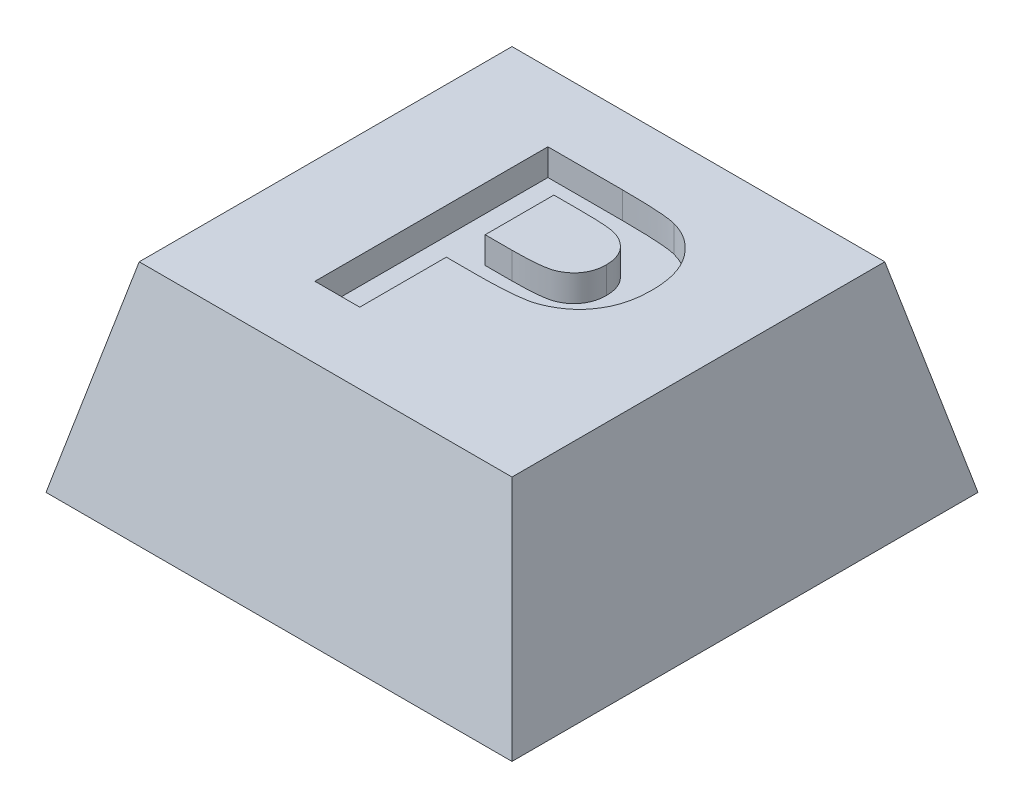
ISO-10303-21;
HEADER;
FILE_DESCRIPTION(('STEP AP214'),'2;1');
FILE_NAME('part.step','',(''),(''),'','','');
FILE_SCHEMA(('AUTOMOTIVE_DESIGN { 1 0 10303 214 1 1 1 1 }'));
ENDSEC;
DATA;
#1=APPLICATION_CONTEXT('core data for automotive mechanical design processes');
#2=APPLICATION_PROTOCOL_DEFINITION('international standard','automotive_design',2000,#1);
#3=PRODUCT_CONTEXT('',#1,'mechanical');
#4=PRODUCT('Part','Part','',(#3));
#5=PRODUCT_RELATED_PRODUCT_CATEGORY('part','',(#4));
#6=PRODUCT_DEFINITION_FORMATION('','',#4);
#7=PRODUCT_DEFINITION_CONTEXT('part definition',#1,'design');
#8=PRODUCT_DEFINITION('design','',#6,#7);
#9=PRODUCT_DEFINITION_SHAPE('','',#8);
#10=(LENGTH_UNIT() NAMED_UNIT(*) SI_UNIT(.MILLI.,.METRE.));
#11=(NAMED_UNIT(*) PLANE_ANGLE_UNIT() SI_UNIT($,.RADIAN.));
#12=(NAMED_UNIT(*) SI_UNIT($,.STERADIAN.) SOLID_ANGLE_UNIT());
#13=UNCERTAINTY_MEASURE_WITH_UNIT(LENGTH_MEASURE(1.E-05),#10,'distance_accuracy_value','');
#14=(GEOMETRIC_REPRESENTATION_CONTEXT(3) GLOBAL_UNCERTAINTY_ASSIGNED_CONTEXT((#13)) GLOBAL_UNIT_ASSIGNED_CONTEXT((#10,
#11,#12)) REPRESENTATION_CONTEXT('',''));
#15=CARTESIAN_POINT('',(0.,0.,0.));
#16=DIRECTION('',(0.,0.,1.));
#17=DIRECTION('',(1.,0.,0.));
#18=AXIS2_PLACEMENT_3D('',#15,#16,#17);
#19=CARTESIAN_POINT('',(0.,3.,0.));
#20=DIRECTION('',(0.,-1.,0.));
#21=DIRECTION('',(0.,0.,-1.));
#22=AXIS2_PLACEMENT_3D('',#19,#20,#21);
#23=PLANE('',#22);
#24=DIRECTION('',(-1.,0.,0.));
#25=VECTOR('',#24,1.);
#26=CARTESIAN_POINT('',(11.,3.,-0.7));
#27=LINE('',#26,#25);
#28=CARTESIAN_POINT('',(6.3,3.,-0.7));
#29=VERTEX_POINT('',#28);
#30=CARTESIAN_POINT('',(0.7,3.,-0.7));
#31=VERTEX_POINT('',#30);
#32=EDGE_CURVE('E375',#29,#31,#27,.T.);
#33=ORIENTED_EDGE('',*,*,#32,.F.);
#34=DIRECTION('',(0.,0.,1.));
#35=VECTOR('',#34,1.);
#36=CARTESIAN_POINT('',(6.3,3.,-7.));
#37=LINE('',#36,#35);
#38=CARTESIAN_POINT('',(6.3,3.,-6.3));
#39=VERTEX_POINT('',#38);
#40=EDGE_CURVE('E387',#39,#29,#37,.T.);
#41=ORIENTED_EDGE('',*,*,#40,.F.);
#42=DIRECTION('',(-1.,0.,0.));
#43=VECTOR('',#42,1.);
#44=CARTESIAN_POINT('',(11.,3.,-6.3));
#45=LINE('',#44,#43);
#46=CARTESIAN_POINT('',(0.699999999999998,3.,-6.3));
#47=VERTEX_POINT('',#46);
#48=EDGE_CURVE('E371',#39,#47,#45,.T.);
#49=ORIENTED_EDGE('',*,*,#48,.T.);
#50=DIRECTION('',(0.,0.,1.));
#51=VECTOR('',#50,1.);
#52=CARTESIAN_POINT('',(0.7,3.,-7.));
#53=LINE('',#52,#51);
#54=EDGE_CURVE('E388',#47,#31,#53,.T.);
#55=ORIENTED_EDGE('',*,*,#54,.T.);
#56=EDGE_LOOP('',(#33,#41,#49,#55));
#57=FACE_BOUND('',#56,.T.);
#58=DIRECTION('',(-1.,0.,0.));
#59=VECTOR('',#58,1.);
#60=CARTESIAN_POINT('',(2.94651388909162,3.,-1.76602931918881));
#61=LINE('',#60,#59);
#62=CARTESIAN_POINT('',(2.94651388909162,3.,-1.76602931918881));
#63=VERTEX_POINT('',#62);
#64=CARTESIAN_POINT('',(2.2734369660147,3.,-1.76602931918881));
#65=VERTEX_POINT('',#64);
#66=EDGE_CURVE('E58',#63,#65,#61,.T.);
#67=ORIENTED_EDGE('',*,*,#66,.T.);
#68=DIRECTION('',(0.,0.,-1.));
#69=VECTOR('',#68,1.);
#70=CARTESIAN_POINT('',(2.2734369660147,3.,-1.76602931918881));
#71=LINE('',#70,#69);
#72=CARTESIAN_POINT('',(2.2734369660147,3.,-5.26602931918881));
#73=VERTEX_POINT('',#72);
#74=EDGE_CURVE('E287',#65,#73,#71,.T.);
#75=ORIENTED_EDGE('',*,*,#74,.T.);
#76=DIRECTION('',(1.,0.,0.));
#77=VECTOR('',#76,1.);
#78=CARTESIAN_POINT('',(2.2734369660147,3.,-5.26602931918881));
#79=LINE('',#78,#77);
#80=CARTESIAN_POINT('',(3.39312847242496,3.,-5.26602931918881));
#81=VERTEX_POINT('',#80);
#82=EDGE_CURVE('E291',#73,#81,#79,.T.);
#83=ORIENTED_EDGE('',*,*,#82,.T.);
#84=CARTESIAN_POINT('',(3.39312847242496,3.,-5.26602931918881));
#85=CARTESIAN_POINT('',(3.44384460666334,3.,-5.26597393477193));
#86=CARTESIAN_POINT('',(3.54084524256604,3.,-5.2658680054905));
#87=CARTESIAN_POINT('',(3.67921078229405,3.,-5.26292484630846));
#88=CARTESIAN_POINT('',(3.80378822142235,3.,-5.25875848015571));
#89=CARTESIAN_POINT('',(3.91439266700303,3.,-5.25356944741172));
#90=CARTESIAN_POINT('',(4.01141330703681,3.,-5.245826413962));
#91=CARTESIAN_POINT('',(4.09441491785956,3.,-5.23686009772664));
#92=CARTESIAN_POINT('',(4.16392015518062,3.,-5.2272147208261));
#93=CARTESIAN_POINT('',(4.20484973044381,3.,-5.21723304572984));
#94=CARTESIAN_POINT('',(4.22325667755316,3.,-5.21274406277855));
#95=B_SPLINE_CURVE_WITH_KNOTS('',3,(#84,#85,#86,#87,#88,#89,#90,#91,#92,#93,#94),.UNSPECIFIED.,
.F.,.F.,(4,1,1,1,1,1,1,1,4),(0.,0.182560685864354,0.34916901466577,0.498161909879465,
0.631255146517795,0.747720654497027,0.848429126955914,0.931835182126823,1.),.UNSPECIFIED.);
#96=CARTESIAN_POINT('',(4.22325667755316,3.,-5.21274406277855));
#97=VERTEX_POINT('',#96);
#98=EDGE_CURVE('E295',#81,#97,#95,.T.);
#99=ORIENTED_EDGE('',*,*,#98,.T.);
#100=CARTESIAN_POINT('',(4.22325667755316,3.,-5.21274406277855));
#101=CARTESIAN_POINT('',(4.24773344106299,3.,-5.20576479426287));
#102=CARTESIAN_POINT('',(4.29631408209239,3.,-5.19191258139689));
#103=CARTESIAN_POINT('',(4.36591499143795,3.,-5.16238186394301));
#104=CARTESIAN_POINT('',(4.43299924674262,3.,-5.12815733784217));
#105=CARTESIAN_POINT('',(4.49672400619187,3.,-5.08736788903686));
#106=CARTESIAN_POINT('',(4.55730589023362,3.,-5.0407376742319));
#107=CARTESIAN_POINT('',(4.61492497598965,3.,-4.98864696887681));
#108=CARTESIAN_POINT('',(4.6698885377768,3.,-4.93086062470867));
#109=CARTESIAN_POINT('',(4.72143622536671,3.,-4.86749279516598));
#110=CARTESIAN_POINT('',(4.7686478432573,3.,-4.79886301373164));
#111=CARTESIAN_POINT('',(4.80945054315446,3.,-4.72486981282646));
#112=CARTESIAN_POINT('',(4.84363467430126,3.,-4.64583480487816));
#113=CARTESIAN_POINT('',(4.87275898590933,3.,-4.56235192811533));
#114=CARTESIAN_POINT('',(4.89424704191297,3.,-4.47352611075403));
#115=CARTESIAN_POINT('',(4.90928477448103,3.,-4.37997452469397));
#116=CARTESIAN_POINT('',(4.91975291269072,3.,-4.28165625246629));
#117=CARTESIAN_POINT('',(4.92049408926106,3.,-4.21437524560431));
#118=CARTESIAN_POINT('',(4.9208728634506,3.,-4.1799916589324));
#119=B_SPLINE_CURVE_WITH_KNOTS('',3,(#100,#101,#102,#103,#104,#105,#106,#107,#108,#109,#110,
#111,#112,#113,#114,#115,#116,#117,#118),.UNSPECIFIED.,.F.,.F.,(4,1,1,1,1,1,1,1,1,1,1,1,1,1,1,1,
4),(0.,0.0566966089636374,0.112529485629921,0.168226041849801,0.224453827384143,
0.280939346530923,0.338491443016692,0.397460189057406,0.458574525663164,0.520430686158555,
0.582933063936771,0.646631562091253,0.712213800813204,0.779824213865235,0.850065838275486,
0.923376975387565,1.),.UNSPECIFIED.);
#120=CARTESIAN_POINT('',(4.9208728634506,3.,-4.1799916589324));
#121=VERTEX_POINT('',#120);
#122=EDGE_CURVE('E301',#97,#121,#119,.T.);
#123=ORIENTED_EDGE('',*,*,#122,.T.);
#124=CARTESIAN_POINT('',(4.9208728634506,3.,-4.1799916589324));
#125=CARTESIAN_POINT('',(4.91979260141583,3.,-4.127776273473));
#126=CARTESIAN_POINT('',(4.91771303768266,3.,-4.02725878936185));
#127=CARTESIAN_POINT('',(4.89444640942433,3.,-3.88315479276662));
#128=CARTESIAN_POINT('',(4.85895907765527,3.,-3.75152508158741));
#129=CARTESIAN_POINT('',(4.80709177819764,3.,-3.63363752313297));
#130=CARTESIAN_POINT('',(4.74385476538337,3.,-3.52902950688606));
#131=CARTESIAN_POINT('',(4.67419789382521,3.,-3.43472587428024));
#132=CARTESIAN_POINT('',(4.59465998302824,3.,-3.35356903257407));
#133=CARTESIAN_POINT('',(4.50872628669571,3.,-3.284249258959));
#134=CARTESIAN_POINT('',(4.41791007550825,3.,-3.22752083221151));
#135=CARTESIAN_POINT('',(4.32692946837898,3.,-3.1791606538283));
#136=CARTESIAN_POINT('',(4.23455681507544,3.,-3.1419798034708));
#137=CARTESIAN_POINT('',(4.17157734572903,3.,-3.12577980795889));
#138=CARTESIAN_POINT('',(4.14052430575829,3.,-3.11779213970163));
#139=B_SPLINE_CURVE_WITH_KNOTS('',3,(#124,#125,#126,#127,#128,#129,#130,#131,#132,#133,#134,
#135,#136,#137,#138),.UNSPECIFIED.,.F.,.F.,(4,1,1,1,1,1,1,1,1,1,1,1,4),(0.,0.109365519513397,
0.210534630229698,0.305156984724238,0.394451765400026,0.479483538783234,0.561008944761299,
0.639657023389005,0.717014175655742,0.791903899167708,0.86378270051793,0.932835870333303,1.),.UNSPECIFIED.);
#140=CARTESIAN_POINT('',(4.14052430575829,3.,-3.11779213970163));
#141=VERTEX_POINT('',#140);
#142=EDGE_CURVE('E310',#121,#141,#139,.T.);
#143=ORIENTED_EDGE('',*,*,#142,.T.);
#144=CARTESIAN_POINT('',(4.14052430575829,3.,-3.11779213970163));
#145=CARTESIAN_POINT('',(4.11836016878902,3.,-3.11357599997096));
#146=CARTESIAN_POINT('',(4.0716408125589,3.,-3.10468888046496));
#147=CARTESIAN_POINT('',(3.99754670840814,3.,-3.09583003982429));
#148=CARTESIAN_POINT('',(3.9165578369515,3.,-3.08602426907442));
#149=CARTESIAN_POINT('',(3.82834108549815,3.,-3.0796283944522));
#150=CARTESIAN_POINT('',(3.73300317332558,3.,-3.0736389260249));
#151=CARTESIAN_POINT('',(3.63058112048286,3.,-3.07081110023836));
#152=CARTESIAN_POINT('',(3.52122129904794,3.,-3.06740414440708));
#153=CARTESIAN_POINT('',(3.44594968980433,3.,-3.06734292568563));
#154=CARTESIAN_POINT('',(3.40715090832239,3.,-3.06731137047086));
#155=B_SPLINE_CURVE_WITH_KNOTS('',3,(#144,#145,#146,#147,#148,#149,#150,#151,#152,#153,#154),
.UNSPECIFIED.,.F.,.F.,(4,1,1,1,1,1,1,1,4),(0.,0.0919192432606359,0.193754797502383,
0.303983189193224,0.424368181524799,0.554124139817009,0.693262123791844,0.841891837429479,1.),.UNSPECIFIED.);
#156=CARTESIAN_POINT('',(3.40715090832239,3.,-3.06731137047086));
#157=VERTEX_POINT('',#156);
#158=EDGE_CURVE('E319',#141,#157,#155,.T.);
#159=ORIENTED_EDGE('',*,*,#158,.T.);
#160=DIRECTION('',(-1.,0.,0.));
#161=VECTOR('',#160,1.);
#162=CARTESIAN_POINT('',(3.40715090832239,3.,-3.06731137047086));
#163=LINE('',#162,#161);
#164=CARTESIAN_POINT('',(2.94651388909162,3.,-3.06731137047086));
#165=VERTEX_POINT('',#164);
#166=EDGE_CURVE('E328',#157,#165,#163,.T.);
#167=ORIENTED_EDGE('',*,*,#166,.T.);
#168=DIRECTION('',(0.,0.,1.));
#169=VECTOR('',#168,1.);
#170=CARTESIAN_POINT('',(2.94651388909162,3.,-3.06731137047086));
#171=LINE('',#170,#169);
#172=EDGE_CURVE('E335',#165,#63,#171,.T.);
#173=ORIENTED_EDGE('',*,*,#172,.T.);
#174=EDGE_LOOP('',(#67,#75,#83,#99,#123,#143,#159,#167,#173));
#175=FACE_BOUND('',#174,.T.);
#176=ADVANCED_FACE('F42',(#57,#175),#23,.F.);
#177=CARTESIAN_POINT('',(7.,0.,-7.));
#178=DIRECTION('',(-0.973841209741793,-0.227229615606418,0.));
#179=DIRECTION('',(0.227229615606418,-0.973841209741793,0.));
#180=AXIS2_PLACEMENT_3D('',#177,#178,#179);
#181=PLANE('',#180);
#182=DIRECTION('',(-0.221581128241521,0.949633406749377,-0.221581128241521));
#183=VECTOR('',#182,1.);
#184=CARTESIAN_POINT('',(6.6563126252505,1.47294589178357,-0.343687374749499));
#185=LINE('',#184,#183);
#186=CARTESIAN_POINT('',(7.,0.,0.));
#187=VERTEX_POINT('',#186);
#188=EDGE_CURVE('E384',#187,#29,#185,.T.);
#189=ORIENTED_EDGE('',*,*,#188,.F.);
#190=DIRECTION('',(0.,0.,-1.));
#191=VECTOR('',#190,1.);
#192=CARTESIAN_POINT('',(7.,0.,0.));
#193=LINE('',#192,#191);
#194=CARTESIAN_POINT('',(7.,0.,-7.));
#195=VERTEX_POINT('',#194);
#196=EDGE_CURVE('E402',#187,#195,#193,.T.);
#197=ORIENTED_EDGE('',*,*,#196,.T.);
#198=DIRECTION('',(0.221581128241521,-0.949633406749377,-0.221581128241521));
#199=VECTOR('',#198,1.);
#200=CARTESIAN_POINT('',(7.,0.,-7.));
#201=LINE('',#200,#199);
#202=EDGE_CURVE('E378',#39,#195,#201,.T.);
#203=ORIENTED_EDGE('',*,*,#202,.F.);
#204=ORIENTED_EDGE('',*,*,#40,.T.);
#205=EDGE_LOOP('',(#189,#197,#203,#204));
#206=FACE_BOUND('',#205,.T.);
#207=ADVANCED_FACE('F428',(#206),#181,.F.);
#208=CARTESIAN_POINT('',(0.,0.,-7.));
#209=DIRECTION('',(0.973841209741793,-0.227229615606418,0.));
#210=DIRECTION('',(0.227229615606418,0.973841209741793,0.));
#211=AXIS2_PLACEMENT_3D('',#208,#209,#210);
#212=PLANE('',#211);
#213=DIRECTION('',(-0.221581128241521,-0.949633406749378,0.221581128241521));
#214=VECTOR('',#213,1.);
#215=CARTESIAN_POINT('',(0.343687374749499,1.47294589178357,-0.3436873747495));
#216=LINE('',#215,#214);
#217=CARTESIAN_POINT('',(0.,0.,0.));
#218=VERTEX_POINT('',#217);
#219=EDGE_CURVE('E11',#31,#218,#216,.T.);
#220=ORIENTED_EDGE('',*,*,#219,.F.);
#221=ORIENTED_EDGE('',*,*,#54,.F.);
#222=DIRECTION('',(0.221581128241521,0.949633406749377,0.221581128241521));
#223=VECTOR('',#222,1.);
#224=CARTESIAN_POINT('',(0.,0.,-7.));
#225=LINE('',#224,#223);
#226=CARTESIAN_POINT('',(0.,0.,-7.));
#227=VERTEX_POINT('',#226);
#228=EDGE_CURVE('E51',#227,#47,#225,.T.);
#229=ORIENTED_EDGE('',*,*,#228,.F.);
#230=DIRECTION('',(0.,0.,1.));
#231=VECTOR('',#230,1.);
#232=CARTESIAN_POINT('',(0.,0.,0.));
#233=LINE('',#232,#231);
#234=EDGE_CURVE('E392',#227,#218,#233,.T.);
#235=ORIENTED_EDGE('',*,*,#234,.T.);
#236=EDGE_LOOP('',(#220,#221,#229,#235));
#237=FACE_BOUND('',#236,.T.);
#238=ADVANCED_FACE('F422',(#237),#212,.F.);
#239=CARTESIAN_POINT('',(0.,0.,0.));
#240=DIRECTION('',(0.,-1.,0.));
#241=DIRECTION('',(0.,0.,-1.));
#242=AXIS2_PLACEMENT_3D('',#239,#240,#241);
#243=PLANE('',#242);
#244=CARTESIAN_POINT('',(3.5,0.,-3.5));
#245=DIRECTION('',(0.,-1.,0.));
#246=DIRECTION('',(0.,0.,-1.));
#247=AXIS2_PLACEMENT_3D('',#244,#245,#246);
#248=CIRCLE('',#247,1.8);
#249=CARTESIAN_POINT('',(3.5,0.,-5.3));
#250=VERTEX_POINT('',#249);
#251=EDGE_CURVE('E366',#250,#250,#248,.T.);
#252=ORIENTED_EDGE('',*,*,#251,.F.);
#253=EDGE_LOOP('',(#252));
#254=FACE_BOUND('',#253,.T.);
#255=ORIENTED_EDGE('',*,*,#234,.F.);
#256=DIRECTION('',(-1.,0.,0.));
#257=VECTOR('',#256,1.);
#258=CARTESIAN_POINT('',(0.,0.,-7.));
#259=LINE('',#258,#257);
#260=EDGE_CURVE('E406',#195,#227,#259,.T.);
#261=ORIENTED_EDGE('',*,*,#260,.F.);
#262=ORIENTED_EDGE('',*,*,#196,.F.);
#263=DIRECTION('',(1.,0.,0.));
#264=VECTOR('',#263,1.);
#265=CARTESIAN_POINT('',(0.,0.,0.));
#266=LINE('',#265,#264);
#267=EDGE_CURVE('E399',#218,#187,#266,.T.);
#268=ORIENTED_EDGE('',*,*,#267,.F.);
#269=EDGE_LOOP('',(#255,#261,#262,#268));
#270=FACE_BOUND('',#269,.T.);
#271=ADVANCED_FACE('F44',(#254,#270),#243,.T.);
#272=CARTESIAN_POINT('',(11.,3.,-6.3));
#273=DIRECTION('',(0.,0.227229615606418,-0.973841209741793));
#274=DIRECTION('',(0.,0.973841209741793,0.227229615606418));
#275=AXIS2_PLACEMENT_3D('',#272,#273,#274);
#276=PLANE('',#275);
#277=ORIENTED_EDGE('',*,*,#202,.T.);
#278=ORIENTED_EDGE('',*,*,#260,.T.);
#279=ORIENTED_EDGE('',*,*,#228,.T.);
#280=ORIENTED_EDGE('',*,*,#48,.F.);
#281=EDGE_LOOP('',(#277,#278,#279,#280));
#282=FACE_BOUND('',#281,.T.);
#283=ADVANCED_FACE('F411',(#282),#276,.T.);
#284=CARTESIAN_POINT('',(11.,0.,0.));
#285=DIRECTION('',(0.,0.227229615606418,0.973841209741793));
#286=DIRECTION('',(0.,-0.973841209741793,0.227229615606418));
#287=AXIS2_PLACEMENT_3D('',#284,#285,#286);
#288=PLANE('',#287);
#289=ORIENTED_EDGE('',*,*,#188,.T.);
#290=ORIENTED_EDGE('',*,*,#32,.T.);
#291=ORIENTED_EDGE('',*,*,#219,.T.);
#292=ORIENTED_EDGE('',*,*,#267,.T.);
#293=EDGE_LOOP('',(#289,#290,#291,#292));
#294=FACE_BOUND('',#293,.T.);
#295=ADVANCED_FACE('F425',(#294),#288,.T.);
#296=CARTESIAN_POINT('',(3.5,0.8,-3.5));
#297=DIRECTION('',(0.,-1.,0.));
#298=DIRECTION('',(0.,0.,-1.));
#299=AXIS2_PLACEMENT_3D('',#296,#297,#298);
#300=CYLINDRICAL_SURFACE('',#299,1.8);
#301=CARTESIAN_POINT('',(3.5,0.8,-3.5));
#302=DIRECTION('',(0.,-1.,0.));
#303=DIRECTION('',(0.,0.,-1.));
#304=AXIS2_PLACEMENT_3D('',#301,#302,#303);
#305=CIRCLE('',#304,1.8);
#306=CARTESIAN_POINT('',(3.5,0.8,-5.3));
#307=VERTEX_POINT('',#306);
#308=EDGE_CURVE('E367',#307,#307,#305,.T.);
#309=ORIENTED_EDGE('',*,*,#308,.F.);
#310=EDGE_LOOP('',(#309));
#311=FACE_BOUND('',#310,.T.);
#312=ORIENTED_EDGE('',*,*,#251,.T.);
#313=EDGE_LOOP('',(#312));
#314=FACE_BOUND('',#313,.T.);
#315=ADVANCED_FACE('F540',(#311,#314),#300,.F.);
#316=CARTESIAN_POINT('',(3.5,0.8,-3.5));
#317=DIRECTION('',(0.,-1.,0.));
#318=DIRECTION('',(0.,0.,-1.));
#319=AXIS2_PLACEMENT_3D('',#316,#317,#318);
#320=PLANE('',#319);
#321=ORIENTED_EDGE('',*,*,#308,.T.);
#322=EDGE_LOOP('',(#321));
#323=FACE_BOUND('',#322,.T.);
#324=ADVANCED_FACE('F537',(#323),#320,.T.);
#325=CARTESIAN_POINT('',(2.94651388909162,2.6,-1.76602931918881));
#326=DIRECTION('',(0.,0.,-1.));
#327=DIRECTION('',(-1.,0.,0.));
#328=AXIS2_PLACEMENT_3D('',#325,#326,#327);
#329=PLANE('',#328);
#330=ORIENTED_EDGE('',*,*,#66,.F.);
#331=DIRECTION('',(0.,1.,0.));
#332=VECTOR('',#331,1.);
#333=CARTESIAN_POINT('',(2.94651388909162,2.6,-1.76602931918881));
#334=LINE('',#333,#332);
#335=CARTESIAN_POINT('',(2.94651388909162,2.6,-1.76602931918881));
#336=VERTEX_POINT('',#335);
#337=EDGE_CURVE('E284',#336,#63,#334,.T.);
#338=ORIENTED_EDGE('',*,*,#337,.F.);
#339=DIRECTION('',(-1.,0.,0.));
#340=VECTOR('',#339,1.);
#341=CARTESIAN_POINT('',(2.94651388909162,2.6,-1.76602931918881));
#342=LINE('',#341,#340);
#343=CARTESIAN_POINT('',(2.2734369660147,2.6,-1.76602931918881));
#344=VERTEX_POINT('',#343);
#345=EDGE_CURVE('E339',#336,#344,#342,.T.);
#346=ORIENTED_EDGE('',*,*,#345,.T.);
#347=DIRECTION('',(0.,1.,0.));
#348=VECTOR('',#347,1.);
#349=CARTESIAN_POINT('',(2.2734369660147,2.6,-1.76602931918881));
#350=LINE('',#349,#348);
#351=EDGE_CURVE('E363',#344,#65,#350,.T.);
#352=ORIENTED_EDGE('',*,*,#351,.T.);
#353=EDGE_LOOP('',(#330,#338,#346,#352));
#354=FACE_BOUND('',#353,.T.);
#355=ADVANCED_FACE('F533',(#354),#329,.T.);
#356=CARTESIAN_POINT('',(2.2734369660147,2.6,-1.76602931918881));
#357=DIRECTION('',(1.,0.,0.));
#358=DIRECTION('',(0.,0.,-1.));
#359=AXIS2_PLACEMENT_3D('',#356,#357,#358);
#360=PLANE('',#359);
#361=ORIENTED_EDGE('',*,*,#74,.F.);
#362=ORIENTED_EDGE('',*,*,#351,.F.);
#363=DIRECTION('',(0.,0.,-1.));
#364=VECTOR('',#363,1.);
#365=CARTESIAN_POINT('',(2.2734369660147,2.6,-1.76602931918881));
#366=LINE('',#365,#364);
#367=CARTESIAN_POINT('',(2.2734369660147,2.6,-5.26602931918881));
#368=VERTEX_POINT('',#367);
#369=EDGE_CURVE('E502',#344,#368,#366,.T.);
#370=ORIENTED_EDGE('',*,*,#369,.T.);
#371=DIRECTION('',(0.,1.,0.));
#372=VECTOR('',#371,1.);
#373=CARTESIAN_POINT('',(2.2734369660147,2.6,-5.26602931918881));
#374=LINE('',#373,#372);
#375=EDGE_CURVE('E360',#368,#73,#374,.T.);
#376=ORIENTED_EDGE('',*,*,#375,.T.);
#377=EDGE_LOOP('',(#361,#362,#370,#376));
#378=FACE_BOUND('',#377,.T.);
#379=ADVANCED_FACE('F529',(#378),#360,.T.);
#380=CARTESIAN_POINT('',(2.2734369660147,2.6,-5.26602931918881));
#381=DIRECTION('',(0.,0.,1.));
#382=DIRECTION('',(1.,0.,0.));
#383=AXIS2_PLACEMENT_3D('',#380,#381,#382);
#384=PLANE('',#383);
#385=ORIENTED_EDGE('',*,*,#82,.F.);
#386=ORIENTED_EDGE('',*,*,#375,.F.);
#387=DIRECTION('',(1.,0.,0.));
#388=VECTOR('',#387,1.);
#389=CARTESIAN_POINT('',(2.2734369660147,2.6,-5.26602931918881));
#390=LINE('',#389,#388);
#391=CARTESIAN_POINT('',(3.39312847242496,2.6,-5.26602931918881));
#392=VERTEX_POINT('',#391);
#393=EDGE_CURVE('E505',#368,#392,#390,.T.);
#394=ORIENTED_EDGE('',*,*,#393,.T.);
#395=DIRECTION('',(0.,1.,0.));
#396=VECTOR('',#395,1.);
#397=CARTESIAN_POINT('',(3.39312847242496,2.6,-5.26602931918881));
#398=LINE('',#397,#396);
#399=EDGE_CURVE('E357',#392,#81,#398,.T.);
#400=ORIENTED_EDGE('',*,*,#399,.T.);
#401=EDGE_LOOP('',(#385,#386,#394,#400));
#402=FACE_BOUND('',#401,.T.);
#403=ADVANCED_FACE('F525',(#402),#384,.T.);
#404=CARTESIAN_POINT('',(3.39312847242496,2.6,-5.26602931918881));
#405=CARTESIAN_POINT('',(3.44384460666334,2.6,-5.26597393477193));
#406=CARTESIAN_POINT('',(3.54084524256604,2.6,-5.2658680054905));
#407=CARTESIAN_POINT('',(3.67921078229405,2.6,-5.26292484630846));
#408=CARTESIAN_POINT('',(3.80378822142235,2.6,-5.25875848015571));
#409=CARTESIAN_POINT('',(3.91439266700303,2.6,-5.25356944741172));
#410=CARTESIAN_POINT('',(4.01141330703681,2.6,-5.245826413962));
#411=CARTESIAN_POINT('',(4.09441491785956,2.6,-5.23686009772664));
#412=CARTESIAN_POINT('',(4.16392015518062,2.6,-5.2272147208261));
#413=CARTESIAN_POINT('',(4.20484973044381,2.6,-5.21723304572984));
#414=CARTESIAN_POINT('',(4.22325667755316,2.6,-5.21274406277855));
#415=B_SPLINE_CURVE_WITH_KNOTS('',3,(#404,#405,#406,#407,#408,#409,#410,#411,#412,#413,#414),
.UNSPECIFIED.,.F.,.F.,(4,1,1,1,1,1,1,1,4),(0.,0.182560685864354,0.34916901466577,
0.498161909879465,0.631255146517795,0.747720654497027,0.848429126955914,0.931835182126823,1.),.UNSPECIFIED.);
#416=DIRECTION('',(0.,1.,0.));
#417=VECTOR('',#416,1.);
#418=SURFACE_OF_LINEAR_EXTRUSION('',#415,#417);
#419=ORIENTED_EDGE('',*,*,#98,.F.);
#420=ORIENTED_EDGE('',*,*,#399,.F.);
#421=CARTESIAN_POINT('',(4.22325667755316,2.6,-5.21274406277855));
#422=VERTEX_POINT('',#421);
#423=EDGE_CURVE('E508',#392,#422,#415,.T.);
#424=ORIENTED_EDGE('',*,*,#423,.T.);
#425=DIRECTION('',(0.,1.,0.));
#426=VECTOR('',#425,1.);
#427=CARTESIAN_POINT('',(4.22325667755316,2.6,-5.21274406277855));
#428=LINE('',#427,#426);
#429=EDGE_CURVE('E354',#422,#97,#428,.T.);
#430=ORIENTED_EDGE('',*,*,#429,.T.);
#431=EDGE_LOOP('',(#419,#420,#424,#430));
#432=FACE_BOUND('',#431,.T.);
#433=ADVANCED_FACE('F521',(#432),#418,.T.);
#434=CARTESIAN_POINT('',(4.22325667755316,2.6,-5.21274406277855));
#435=CARTESIAN_POINT('',(4.24773344106299,2.6,-5.20576479426287));
#436=CARTESIAN_POINT('',(4.29631408209239,2.6,-5.19191258139689));
#437=CARTESIAN_POINT('',(4.36591499143795,2.6,-5.16238186394301));
#438=CARTESIAN_POINT('',(4.43299924674262,2.6,-5.12815733784217));
#439=CARTESIAN_POINT('',(4.49672400619187,2.6,-5.08736788903686));
#440=CARTESIAN_POINT('',(4.55730589023362,2.6,-5.0407376742319));
#441=CARTESIAN_POINT('',(4.61492497598965,2.6,-4.98864696887681));
#442=CARTESIAN_POINT('',(4.6698885377768,2.6,-4.93086062470867));
#443=CARTESIAN_POINT('',(4.72143622536671,2.6,-4.86749279516598));
#444=CARTESIAN_POINT('',(4.7686478432573,2.6,-4.79886301373164));
#445=CARTESIAN_POINT('',(4.80945054315446,2.6,-4.72486981282646));
#446=CARTESIAN_POINT('',(4.84363467430126,2.6,-4.64583480487816));
#447=CARTESIAN_POINT('',(4.87275898590933,2.6,-4.56235192811533));
#448=CARTESIAN_POINT('',(4.89424704191297,2.6,-4.47352611075403));
#449=CARTESIAN_POINT('',(4.90928477448103,2.6,-4.37997452469397));
#450=CARTESIAN_POINT('',(4.91975291269072,2.6,-4.28165625246629));
#451=CARTESIAN_POINT('',(4.92049408926106,2.6,-4.21437524560431));
#452=CARTESIAN_POINT('',(4.9208728634506,2.6,-4.1799916589324));
#453=B_SPLINE_CURVE_WITH_KNOTS('',3,(#434,#435,#436,#437,#438,#439,#440,#441,#442,#443,#444,
#445,#446,#447,#448,#449,#450,#451,#452),.UNSPECIFIED.,.F.,.F.,(4,1,1,1,1,1,1,1,1,1,1,1,1,1,1,1,
4),(0.,0.0566966089636374,0.112529485629921,0.168226041849801,0.224453827384143,
0.280939346530923,0.338491443016692,0.397460189057406,0.458574525663164,0.520430686158555,
0.582933063936771,0.646631562091253,0.712213800813204,0.779824213865235,0.850065838275486,
0.923376975387565,1.),.UNSPECIFIED.);
#454=DIRECTION('',(0.,1.,0.));
#455=VECTOR('',#454,1.);
#456=SURFACE_OF_LINEAR_EXTRUSION('',#453,#455);
#457=ORIENTED_EDGE('',*,*,#122,.F.);
#458=ORIENTED_EDGE('',*,*,#429,.F.);
#459=CARTESIAN_POINT('',(4.9208728634506,2.6,-4.1799916589324));
#460=VERTEX_POINT('',#459);
#461=EDGE_CURVE('E513',#422,#460,#453,.T.);
#462=ORIENTED_EDGE('',*,*,#461,.T.);
#463=DIRECTION('',(0.,1.,0.));
#464=VECTOR('',#463,1.);
#465=CARTESIAN_POINT('',(4.9208728634506,2.6,-4.1799916589324));
#466=LINE('',#465,#464);
#467=EDGE_CURVE('E351',#460,#121,#466,.T.);
#468=ORIENTED_EDGE('',*,*,#467,.T.);
#469=EDGE_LOOP('',(#457,#458,#462,#468));
#470=FACE_BOUND('',#469,.T.);
#471=ADVANCED_FACE('F524',(#470),#456,.T.);
#472=CARTESIAN_POINT('',(4.9208728634506,2.6,-4.1799916589324));
#473=CARTESIAN_POINT('',(4.91979260141583,2.6,-4.127776273473));
#474=CARTESIAN_POINT('',(4.91771303768266,2.6,-4.02725878936185));
#475=CARTESIAN_POINT('',(4.89444640942433,2.6,-3.88315479276662));
#476=CARTESIAN_POINT('',(4.85895907765527,2.6,-3.75152508158741));
#477=CARTESIAN_POINT('',(4.80709177819764,2.6,-3.63363752313297));
#478=CARTESIAN_POINT('',(4.74385476538337,2.6,-3.52902950688606));
#479=CARTESIAN_POINT('',(4.67419789382521,2.6,-3.43472587428024));
#480=CARTESIAN_POINT('',(4.59465998302824,2.6,-3.35356903257407));
#481=CARTESIAN_POINT('',(4.50872628669571,2.6,-3.284249258959));
#482=CARTESIAN_POINT('',(4.41791007550825,2.6,-3.22752083221151));
#483=CARTESIAN_POINT('',(4.32692946837898,2.6,-3.1791606538283));
#484=CARTESIAN_POINT('',(4.23455681507544,2.6,-3.1419798034708));
#485=CARTESIAN_POINT('',(4.17157734572903,2.6,-3.12577980795889));
#486=CARTESIAN_POINT('',(4.14052430575829,2.6,-3.11779213970163));
#487=B_SPLINE_CURVE_WITH_KNOTS('',3,(#472,#473,#474,#475,#476,#477,#478,#479,#480,#481,#482,
#483,#484,#485,#486),.UNSPECIFIED.,.F.,.F.,(4,1,1,1,1,1,1,1,1,1,1,1,4),(0.,0.109365519513397,
0.210534630229698,0.305156984724238,0.394451765400026,0.479483538783234,0.561008944761299,
0.639657023389005,0.717014175655742,0.791903899167708,0.86378270051793,0.932835870333303,1.),.UNSPECIFIED.);
#488=DIRECTION('',(0.,1.,0.));
#489=VECTOR('',#488,1.);
#490=SURFACE_OF_LINEAR_EXTRUSION('',#487,#489);
#491=ORIENTED_EDGE('',*,*,#142,.F.);
#492=ORIENTED_EDGE('',*,*,#467,.F.);
#493=CARTESIAN_POINT('',(4.14052430575829,2.6,-3.11779213970163));
#494=VERTEX_POINT('',#493);
#495=EDGE_CURVE('E271',#460,#494,#487,.T.);
#496=ORIENTED_EDGE('',*,*,#495,.T.);
#497=DIRECTION('',(0.,1.,0.));
#498=VECTOR('',#497,1.);
#499=CARTESIAN_POINT('',(4.14052430575829,2.6,-3.11779213970163));
#500=LINE('',#499,#498);
#501=EDGE_CURVE('E348',#494,#141,#500,.T.);
#502=ORIENTED_EDGE('',*,*,#501,.T.);
#503=EDGE_LOOP('',(#491,#492,#496,#502));
#504=FACE_BOUND('',#503,.T.);
#505=ADVANCED_FACE('F260',(#504),#490,.T.);
#506=CARTESIAN_POINT('',(4.14052430575829,2.6,-3.11779213970163));
#507=CARTESIAN_POINT('',(4.11836016878902,2.6,-3.11357599997096));
#508=CARTESIAN_POINT('',(4.0716408125589,2.6,-3.10468888046496));
#509=CARTESIAN_POINT('',(3.99754670840814,2.6,-3.09583003982429));
#510=CARTESIAN_POINT('',(3.9165578369515,2.6,-3.08602426907442));
#511=CARTESIAN_POINT('',(3.82834108549815,2.6,-3.0796283944522));
#512=CARTESIAN_POINT('',(3.73300317332558,2.6,-3.0736389260249));
#513=CARTESIAN_POINT('',(3.63058112048286,2.6,-3.07081110023836));
#514=CARTESIAN_POINT('',(3.52122129904794,2.6,-3.06740414440708));
#515=CARTESIAN_POINT('',(3.44594968980433,2.6,-3.06734292568563));
#516=CARTESIAN_POINT('',(3.40715090832239,2.6,-3.06731137047086));
#517=B_SPLINE_CURVE_WITH_KNOTS('',3,(#506,#507,#508,#509,#510,#511,#512,#513,#514,#515,#516),
.UNSPECIFIED.,.F.,.F.,(4,1,1,1,1,1,1,1,4),(0.,0.0919192432606359,0.193754797502383,
0.303983189193224,0.424368181524799,0.554124139817009,0.693262123791844,0.841891837429479,1.),.UNSPECIFIED.);
#518=DIRECTION('',(0.,1.,0.));
#519=VECTOR('',#518,1.);
#520=SURFACE_OF_LINEAR_EXTRUSION('',#517,#519);
#521=ORIENTED_EDGE('',*,*,#158,.F.);
#522=ORIENTED_EDGE('',*,*,#501,.F.);
#523=CARTESIAN_POINT('',(3.40715090832239,2.6,-3.06731137047086));
#524=VERTEX_POINT('',#523);
#525=EDGE_CURVE('E264',#494,#524,#517,.T.);
#526=ORIENTED_EDGE('',*,*,#525,.T.);
#527=DIRECTION('',(0.,1.,0.));
#528=VECTOR('',#527,1.);
#529=CARTESIAN_POINT('',(3.40715090832239,2.6,-3.06731137047086));
#530=LINE('',#529,#528);
#531=EDGE_CURVE('E345',#524,#157,#530,.T.);
#532=ORIENTED_EDGE('',*,*,#531,.T.);
#533=EDGE_LOOP('',(#521,#522,#526,#532));
#534=FACE_BOUND('',#533,.T.);
#535=ADVANCED_FACE('F255',(#534),#520,.T.);
#536=CARTESIAN_POINT('',(3.40715090832239,2.6,-3.06731137047086));
#537=DIRECTION('',(0.,0.,-1.));
#538=DIRECTION('',(-1.,0.,0.));
#539=AXIS2_PLACEMENT_3D('',#536,#537,#538);
#540=PLANE('',#539);
#541=ORIENTED_EDGE('',*,*,#166,.F.);
#542=ORIENTED_EDGE('',*,*,#531,.F.);
#543=DIRECTION('',(-1.,0.,0.));
#544=VECTOR('',#543,1.);
#545=CARTESIAN_POINT('',(3.40715090832239,2.6,-3.06731137047086));
#546=LINE('',#545,#544);
#547=CARTESIAN_POINT('',(2.94651388909162,2.6,-3.06731137047086));
#548=VERTEX_POINT('',#547);
#549=EDGE_CURVE('E270',#524,#548,#546,.T.);
#550=ORIENTED_EDGE('',*,*,#549,.T.);
#551=DIRECTION('',(0.,1.,0.));
#552=VECTOR('',#551,1.);
#553=CARTESIAN_POINT('',(2.94651388909162,2.6,-3.06731137047086));
#554=LINE('',#553,#552);
#555=EDGE_CURVE('E342',#548,#165,#554,.T.);
#556=ORIENTED_EDGE('',*,*,#555,.T.);
#557=EDGE_LOOP('',(#541,#542,#550,#556));
#558=FACE_BOUND('',#557,.T.);
#559=ADVANCED_FACE('F251',(#558),#540,.T.);
#560=CARTESIAN_POINT('',(2.94651388909162,2.6,-3.06731137047086));
#561=DIRECTION('',(-1.,0.,0.));
#562=DIRECTION('',(0.,0.,1.));
#563=AXIS2_PLACEMENT_3D('',#560,#561,#562);
#564=PLANE('',#563);
#565=ORIENTED_EDGE('',*,*,#172,.F.);
#566=ORIENTED_EDGE('',*,*,#555,.F.);
#567=DIRECTION('',(0.,0.,1.));
#568=VECTOR('',#567,1.);
#569=CARTESIAN_POINT('',(2.94651388909162,2.6,-3.06731137047086));
#570=LINE('',#569,#568);
#571=EDGE_CURVE('E281',#548,#336,#570,.T.);
#572=ORIENTED_EDGE('',*,*,#571,.T.);
#573=ORIENTED_EDGE('',*,*,#337,.T.);
#574=EDGE_LOOP('',(#565,#566,#572,#573));
#575=FACE_BOUND('',#574,.T.);
#576=ADVANCED_FACE('F248',(#575),#564,.T.);
#577=CARTESIAN_POINT('',(3.80972320215796,2.6,-5.25825476527323));
#578=DIRECTION('',(0.,1.,-1.18682808246816E-12));
#579=DIRECTION('',(0.,1.18682808246816E-12,1.));
#580=AXIS2_PLACEMENT_3D('',#577,#578,#579);
#581=PLANE('',#580);
#582=CARTESIAN_POINT('',(3.83413408139931,2.6,-4.65815672303496));
#583=CARTESIAN_POINT('',(3.82176230200419,2.6,-4.66013548827649));
#584=CARTESIAN_POINT('',(3.79430078759686,2.6,-4.66452773359976));
#585=CARTESIAN_POINT('',(3.74865416188279,2.6,-4.66911158783652));
#586=CARTESIAN_POINT('',(3.69465419651644,2.6,-4.67328059865181));
#587=CARTESIAN_POINT('',(3.63223579973954,2.6,-4.67670348108541));
#588=CARTESIAN_POINT('',(3.5616463825142,2.6,-4.67937938257397));
#589=CARTESIAN_POINT('',(3.48265310916874,2.6,-4.68172413223138));
#590=CARTESIAN_POINT('',(3.39546402354807,2.6,-4.68191250172577));
#591=CARTESIAN_POINT('',(3.33446737798707,2.6,-4.68242758868922));
#592=CARTESIAN_POINT('',(3.30268376088649,2.6,-4.68269598585548));
#593=B_SPLINE_CURVE_WITH_KNOTS('',3,(#582,#583,#584,#585,#586,#587,#588,#589,#590,#591,#592),
.UNSPECIFIED.,.F.,.F.,(4,1,1,1,1,1,1,1,4),(0.,0.0705753751012049,0.156655450945649,
0.258348344782105,0.375719036051342,0.508809542827526,0.656332342734555,0.82092455858982,1.),.UNSPECIFIED.);
#594=CARTESIAN_POINT('',(3.83413408139931,2.6,-4.65815672303496));
#595=VERTEX_POINT('',#594);
#596=CARTESIAN_POINT('',(3.30268376088649,2.6,-4.68269598585548));
#597=VERTEX_POINT('',#596);
#598=EDGE_CURVE('E188',#595,#597,#593,.T.);
#599=ORIENTED_EDGE('',*,*,#598,.F.);
#600=CARTESIAN_POINT('',(4.24779594037367,2.6,-4.16947483200932));
#601=CARTESIAN_POINT('',(4.24669373846641,2.6,-4.20118456486591));
#602=CARTESIAN_POINT('',(4.24455671429711,2.6,-4.26266555584379));
#603=CARTESIAN_POINT('',(4.22099130316851,2.6,-4.35022474774091));
#604=CARTESIAN_POINT('',(4.18463256661557,2.6,-4.42968577588008));
#605=CARTESIAN_POINT('',(4.13264989585783,2.6,-4.49857624902668));
#606=CARTESIAN_POINT('',(4.06985605304744,2.6,-4.55650747167855));
#607=CARTESIAN_POINT('',(3.99927839441055,2.6,-4.60470830857285));
#608=CARTESIAN_POINT('',(3.91940970209804,2.6,-4.63843962115301));
#609=CARTESIAN_POINT('',(3.86288407569711,2.6,-4.65150925964472));
#610=CARTESIAN_POINT('',(3.83413408139931,2.6,-4.65815672303496));
#611=B_SPLINE_CURVE_WITH_KNOTS('',3,(#600,#601,#602,#603,#604,#605,#606,#607,#608,#609,#610),
.UNSPECIFIED.,.F.,.F.,(4,1,1,1,1,1,1,1,4),(0.,0.135738070383497,0.263178220969092,
0.38608813637491,0.508621177402748,0.630648535451456,0.751346205248274,0.873530013970423,1.),.UNSPECIFIED.);
#612=CARTESIAN_POINT('',(4.24779594037367,2.6,-4.16947483200932));
#613=VERTEX_POINT('',#612);
#614=EDGE_CURVE('E221',#613,#595,#611,.T.);
#615=ORIENTED_EDGE('',*,*,#614,.F.);
#616=CARTESIAN_POINT('',(3.35036004293778,2.6,-3.65064470380419));
#617=CARTESIAN_POINT('',(3.38518548400421,2.6,-3.65068979981051));
#618=CARTESIAN_POINT('',(3.45181093438151,2.6,-3.65077607414443));
#619=CARTESIAN_POINT('',(3.54740367640032,2.6,-3.65387281673646));
#620=CARTESIAN_POINT('',(3.63393431708565,2.6,-3.65765296534355));
#621=CARTESIAN_POINT('',(3.71158365917658,2.6,-3.66390988474494));
#622=CARTESIAN_POINT('',(3.77988299068773,2.6,-3.67215635492256));
#623=CARTESIAN_POINT('',(3.83928969551777,2.6,-3.68202017188548));
#624=CARTESIAN_POINT('',(3.88987301078939,2.6,-3.69260507804111));
#625=CARTESIAN_POINT('',(3.94457197993937,2.6,-3.710145963746));
#626=CARTESIAN_POINT('',(4.00305611407144,2.6,-3.73852551732106));
#627=CARTESIAN_POINT('',(4.06551029622501,2.6,-3.77931406400409));
#628=CARTESIAN_POINT('',(4.12037622149703,2.6,-3.82808158212819));
#629=CARTESIAN_POINT('',(4.16603194355409,2.6,-3.88535734338238));
#630=CARTESIAN_POINT('',(4.2025007572973,2.6,-3.94899403258728));
#631=CARTESIAN_POINT('',(4.22861245449958,2.6,-4.01833947990978));
#632=CARTESIAN_POINT('',(4.24547275284533,2.6,-4.09224438876013));
#633=CARTESIAN_POINT('',(4.24701278739792,2.6,-4.14344023483982));
#634=CARTESIAN_POINT('',(4.24779594037367,2.6,-4.16947483200932));
#635=B_SPLINE_CURVE_WITH_KNOTS('',3,(#616,#617,#618,#619,#620,#621,#622,#623,#624,#625,#626,
#627,#628,#629,#630,#631,#632,#633,#634),.UNSPECIFIED.,.F.,.F.,(4,1,1,1,1,1,1,1,1,1,1,1,1,1,1,1,
4),(0.,0.088231622383754,0.168798194619351,0.242310106178019,0.30766373202845,0.366127388811563,
0.41655369001194,0.460228162252661,0.496931612906356,0.561824891954991,0.624233737849063,
0.685457084882651,0.746954721198572,0.809017075528236,0.87049190114741,0.934141313368152,1.),.UNSPECIFIED.);
#636=CARTESIAN_POINT('',(3.35036004293778,2.6,-3.65064470380419));
#637=VERTEX_POINT('',#636);
#638=EDGE_CURVE('E214',#637,#613,#635,.T.);
#639=ORIENTED_EDGE('',*,*,#638,.F.);
#640=DIRECTION('',(1.,0.,0.));
#641=VECTOR('',#640,1.);
#642=CARTESIAN_POINT('',(2.94651388909162,2.6,-3.65064470380419));
#643=LINE('',#642,#641);
#644=CARTESIAN_POINT('',(2.94651388909162,2.60000000000192,-3.65064470380419));
#645=VERTEX_POINT('',#644);
#646=EDGE_CURVE('E199',#645,#637,#643,.T.);
#647=ORIENTED_EDGE('',*,*,#646,.F.);
#648=DIRECTION('',(0.,0.,1.));
#649=VECTOR('',#648,1.);
#650=CARTESIAN_POINT('',(2.94651388909162,2.6,-4.68269598585548));
#651=LINE('',#650,#649);
#652=CARTESIAN_POINT('',(2.94651388909162,2.6,-4.68269598585548));
#653=VERTEX_POINT('',#652);
#654=EDGE_CURVE('E179',#653,#645,#651,.T.);
#655=ORIENTED_EDGE('',*,*,#654,.F.);
#656=DIRECTION('',(-1.,0.,0.));
#657=VECTOR('',#656,1.);
#658=CARTESIAN_POINT('',(3.30268376088649,2.6,-4.68269598585548));
#659=LINE('',#658,#657);
#660=EDGE_CURVE('E195',#597,#653,#659,.T.);
#661=ORIENTED_EDGE('',*,*,#660,.F.);
#662=EDGE_LOOP('',(#599,#615,#639,#647,#655,#661));
#663=FACE_BOUND('',#662,.T.);
#664=ORIENTED_EDGE('',*,*,#345,.F.);
#665=ORIENTED_EDGE('',*,*,#571,.F.);
#666=ORIENTED_EDGE('',*,*,#549,.F.);
#667=ORIENTED_EDGE('',*,*,#525,.F.);
#668=ORIENTED_EDGE('',*,*,#495,.F.);
#669=ORIENTED_EDGE('',*,*,#461,.F.);
#670=ORIENTED_EDGE('',*,*,#423,.F.);
#671=ORIENTED_EDGE('',*,*,#393,.F.);
#672=ORIENTED_EDGE('',*,*,#369,.F.);
#673=EDGE_LOOP('',(#664,#665,#666,#667,#668,#669,#670,#671,#672));
#674=FACE_BOUND('',#673,.T.);
#675=ADVANCED_FACE('F193',(#663,#674),#581,.T.);
#676=CARTESIAN_POINT('',(3.30268376088649,2.6,-4.68269598585548));
#677=DIRECTION('',(0.,0.,-1.));
#678=DIRECTION('',(-1.,0.,0.));
#679=AXIS2_PLACEMENT_3D('',#676,#677,#678);
#680=PLANE('',#679);
#681=DIRECTION('',(-1.,0.,0.));
#682=VECTOR('',#681,1.);
#683=CARTESIAN_POINT('',(3.30268376088649,3.,-4.68269598585548));
#684=LINE('',#683,#682);
#685=CARTESIAN_POINT('',(3.30268376088649,3.,-4.68269598585548));
#686=VERTEX_POINT('',#685);
#687=CARTESIAN_POINT('',(2.94651388909162,3.00000000000069,-4.68269598585548));
#688=VERTEX_POINT('',#687);
#689=EDGE_CURVE('E452',#686,#688,#684,.T.);
#690=ORIENTED_EDGE('',*,*,#689,.F.);
#691=DIRECTION('',(0.,1.,0.));
#692=VECTOR('',#691,1.);
#693=CARTESIAN_POINT('',(3.30268376088649,2.6,-4.68269598585548));
#694=LINE('',#693,#692);
#695=EDGE_CURVE('E203',#597,#686,#694,.T.);
#696=ORIENTED_EDGE('',*,*,#695,.F.);
#697=ORIENTED_EDGE('',*,*,#660,.T.);
#698=DIRECTION('',(0.,1.,0.));
#699=VECTOR('',#698,1.);
#700=CARTESIAN_POINT('',(2.94651388909162,2.6,-4.68269598585548));
#701=LINE('',#700,#699);
#702=EDGE_CURVE('E176',#653,#688,#701,.T.);
#703=ORIENTED_EDGE('',*,*,#702,.T.);
#704=EDGE_LOOP('',(#690,#696,#697,#703));
#705=FACE_BOUND('',#704,.T.);
#706=ADVANCED_FACE('F202',(#705),#680,.T.);
#707=DIRECTION('',(0.,1.,0.));
#708=VECTOR('',#707,1.);
#709=SURFACE_OF_LINEAR_EXTRUSION('',#593,#708);
#710=CARTESIAN_POINT('',(3.83413408139931,3.,-4.65815672303496));
#711=CARTESIAN_POINT('',(3.82176230200419,3.,-4.66013548827649));
#712=CARTESIAN_POINT('',(3.79430078759686,3.,-4.66452773359976));
#713=CARTESIAN_POINT('',(3.74865416188279,3.,-4.66911158783652));
#714=CARTESIAN_POINT('',(3.69465419651644,3.,-4.67328059865181));
#715=CARTESIAN_POINT('',(3.63223579973954,3.,-4.67670348108541));
#716=CARTESIAN_POINT('',(3.5616463825142,3.,-4.67937938257397));
#717=CARTESIAN_POINT('',(3.48265310916874,3.,-4.68172413223138));
#718=CARTESIAN_POINT('',(3.39546402354807,3.,-4.68191250172577));
#719=CARTESIAN_POINT('',(3.33446737798707,3.,-4.68242758868922));
#720=CARTESIAN_POINT('',(3.30268376088649,3.,-4.68269598585548));
#721=B_SPLINE_CURVE_WITH_KNOTS('',3,(#710,#711,#712,#713,#714,#715,#716,#717,#718,#719,#720),
.UNSPECIFIED.,.F.,.F.,(4,1,1,1,1,1,1,1,4),(0.,0.0705753751012049,0.156655450945649,
0.258348344782105,0.375719036051342,0.508809542827526,0.656332342734555,0.82092455858982,1.),.UNSPECIFIED.);
#722=CARTESIAN_POINT('',(3.83413408139931,3.,-4.65815672303496));
#723=VERTEX_POINT('',#722);
#724=EDGE_CURVE('E205',#723,#686,#721,.T.);
#725=ORIENTED_EDGE('',*,*,#724,.F.);
#726=DIRECTION('',(0.,1.,0.));
#727=VECTOR('',#726,1.);
#728=CARTESIAN_POINT('',(3.83413408139931,2.6,-4.65815672303496));
#729=LINE('',#728,#727);
#730=EDGE_CURVE('E488',#595,#723,#729,.T.);
#731=ORIENTED_EDGE('',*,*,#730,.F.);
#732=ORIENTED_EDGE('',*,*,#598,.T.);
#733=ORIENTED_EDGE('',*,*,#695,.T.);
#734=EDGE_LOOP('',(#725,#731,#732,#733));
#735=FACE_BOUND('',#734,.T.);
#736=ADVANCED_FACE('F245',(#735),#709,.T.);
#737=DIRECTION('',(0.,1.,0.));
#738=VECTOR('',#737,1.);
#739=SURFACE_OF_LINEAR_EXTRUSION('',#611,#738);
#740=CARTESIAN_POINT('',(4.24779594037367,3.,-4.16947483200932));
#741=CARTESIAN_POINT('',(4.24669373846641,3.,-4.20118456486591));
#742=CARTESIAN_POINT('',(4.24455671429711,3.,-4.26266555584379));
#743=CARTESIAN_POINT('',(4.22099130316851,3.,-4.35022474774091));
#744=CARTESIAN_POINT('',(4.18463256661557,3.,-4.42968577588008));
#745=CARTESIAN_POINT('',(4.13264989585783,3.,-4.49857624902668));
#746=CARTESIAN_POINT('',(4.06985605304744,3.,-4.55650747167855));
#747=CARTESIAN_POINT('',(3.99927839441055,3.,-4.60470830857285));
#748=CARTESIAN_POINT('',(3.91940970209804,3.,-4.63843962115301));
#749=CARTESIAN_POINT('',(3.86288407569711,3.,-4.65150925964472));
#750=CARTESIAN_POINT('',(3.83413408139931,3.,-4.65815672303496));
#751=B_SPLINE_CURVE_WITH_KNOTS('',3,(#740,#741,#742,#743,#744,#745,#746,#747,#748,#749,#750),
.UNSPECIFIED.,.F.,.F.,(4,1,1,1,1,1,1,1,4),(0.,0.135738070383497,0.263178220969092,
0.38608813637491,0.508621177402748,0.630648535451456,0.751346205248274,0.873530013970423,1.),.UNSPECIFIED.);
#752=CARTESIAN_POINT('',(4.24779594037367,3.,-4.16947483200932));
#753=VERTEX_POINT('',#752);
#754=EDGE_CURVE('E209',#753,#723,#751,.T.);
#755=ORIENTED_EDGE('',*,*,#754,.F.);
#756=DIRECTION('',(0.,1.,0.));
#757=VECTOR('',#756,1.);
#758=CARTESIAN_POINT('',(4.24779594037367,2.6,-4.16947483200932));
#759=LINE('',#758,#757);
#760=EDGE_CURVE('E491',#613,#753,#759,.T.);
#761=ORIENTED_EDGE('',*,*,#760,.F.);
#762=ORIENTED_EDGE('',*,*,#614,.T.);
#763=ORIENTED_EDGE('',*,*,#730,.T.);
#764=EDGE_LOOP('',(#755,#761,#762,#763));
#765=FACE_BOUND('',#764,.T.);
#766=ADVANCED_FACE('F235',(#765),#739,.T.);
#767=DIRECTION('',(0.,1.,0.));
#768=VECTOR('',#767,1.);
#769=SURFACE_OF_LINEAR_EXTRUSION('',#635,#768);
#770=CARTESIAN_POINT('',(3.35036004293778,3.,-3.65064470380419));
#771=CARTESIAN_POINT('',(3.38518548400421,3.,-3.65068979981051));
#772=CARTESIAN_POINT('',(3.45181093438151,3.,-3.65077607414443));
#773=CARTESIAN_POINT('',(3.54740367640032,3.,-3.65387281673646));
#774=CARTESIAN_POINT('',(3.63393431708565,3.,-3.65765296534355));
#775=CARTESIAN_POINT('',(3.71158365917658,3.,-3.66390988474494));
#776=CARTESIAN_POINT('',(3.77988299068773,3.,-3.67215635492256));
#777=CARTESIAN_POINT('',(3.83928969551777,3.,-3.68202017188548));
#778=CARTESIAN_POINT('',(3.88987301078939,3.,-3.69260507804111));
#779=CARTESIAN_POINT('',(3.94457197993937,3.,-3.710145963746));
#780=CARTESIAN_POINT('',(4.00305611407144,3.,-3.73852551732106));
#781=CARTESIAN_POINT('',(4.06551029622501,3.,-3.77931406400409));
#782=CARTESIAN_POINT('',(4.12037622149703,3.,-3.82808158212819));
#783=CARTESIAN_POINT('',(4.16603194355409,3.,-3.88535734338238));
#784=CARTESIAN_POINT('',(4.2025007572973,3.,-3.94899403258728));
#785=CARTESIAN_POINT('',(4.22861245449958,3.,-4.01833947990978));
#786=CARTESIAN_POINT('',(4.24547275284533,3.,-4.09224438876013));
#787=CARTESIAN_POINT('',(4.24701278739792,3.,-4.14344023483982));
#788=CARTESIAN_POINT('',(4.24779594037367,3.,-4.16947483200932));
#789=B_SPLINE_CURVE_WITH_KNOTS('',3,(#770,#771,#772,#773,#774,#775,#776,#777,#778,#779,#780,
#781,#782,#783,#784,#785,#786,#787,#788),.UNSPECIFIED.,.F.,.F.,(4,1,1,1,1,1,1,1,1,1,1,1,1,1,1,1,
4),(0.,0.088231622383754,0.168798194619351,0.242310106178019,0.30766373202845,0.366127388811563,
0.41655369001194,0.460228162252661,0.496931612906356,0.561824891954991,0.624233737849063,
0.685457084882651,0.746954721198572,0.809017075528236,0.87049190114741,0.934141313368152,1.),.UNSPECIFIED.);
#790=CARTESIAN_POINT('',(3.35036004293778,3.,-3.65064470380419));
#791=VERTEX_POINT('',#790);
#792=EDGE_CURVE('E465',#791,#753,#789,.T.);
#793=ORIENTED_EDGE('',*,*,#792,.F.);
#794=DIRECTION('',(0.,1.,0.));
#795=VECTOR('',#794,1.);
#796=CARTESIAN_POINT('',(3.35036004293778,2.6,-3.65064470380419));
#797=LINE('',#796,#795);
#798=EDGE_CURVE('E494',#637,#791,#797,.T.);
#799=ORIENTED_EDGE('',*,*,#798,.F.);
#800=ORIENTED_EDGE('',*,*,#638,.T.);
#801=ORIENTED_EDGE('',*,*,#760,.T.);
#802=EDGE_LOOP('',(#793,#799,#800,#801));
#803=FACE_BOUND('',#802,.T.);
#804=ADVANCED_FACE('F230',(#803),#769,.T.);
#805=CARTESIAN_POINT('',(2.94651388909162,2.6,-3.65064470380419));
#806=DIRECTION('',(0.,0.,1.));
#807=DIRECTION('',(1.,0.,0.));
#808=AXIS2_PLACEMENT_3D('',#805,#806,#807);
#809=PLANE('',#808);
#810=DIRECTION('',(1.,0.,0.));
#811=VECTOR('',#810,1.);
#812=CARTESIAN_POINT('',(2.94651388909162,3.,-3.65064470380419));
#813=LINE('',#812,#811);
#814=CARTESIAN_POINT('',(2.94651388909162,3.,-3.65064470380419));
#815=VERTEX_POINT('',#814);
#816=EDGE_CURVE('E66',#815,#791,#813,.T.);
#817=ORIENTED_EDGE('',*,*,#816,.F.);
#818=DIRECTION('',(0.,1.,0.));
#819=VECTOR('',#818,1.);
#820=CARTESIAN_POINT('',(2.94651388909162,2.6,-3.65064470380419));
#821=LINE('',#820,#819);
#822=EDGE_CURVE('E187',#645,#815,#821,.T.);
#823=ORIENTED_EDGE('',*,*,#822,.F.);
#824=ORIENTED_EDGE('',*,*,#646,.T.);
#825=ORIENTED_EDGE('',*,*,#798,.T.);
#826=EDGE_LOOP('',(#817,#823,#824,#825));
#827=FACE_BOUND('',#826,.T.);
#828=ADVANCED_FACE('F234',(#827),#809,.T.);
#829=CARTESIAN_POINT('',(2.94651388909162,2.6,-4.68269598585548));
#830=DIRECTION('',(-1.,0.,0.));
#831=DIRECTION('',(0.,0.,1.));
#832=AXIS2_PLACEMENT_3D('',#829,#830,#831);
#833=PLANE('',#832);
#834=DIRECTION('',(0.,0.,1.));
#835=VECTOR('',#834,1.);
#836=CARTESIAN_POINT('',(2.94651388909162,3.,-4.68269598585548));
#837=LINE('',#836,#835);
#838=EDGE_CURVE('E181',#688,#815,#837,.T.);
#839=ORIENTED_EDGE('',*,*,#838,.F.);
#840=ORIENTED_EDGE('',*,*,#702,.F.);
#841=ORIENTED_EDGE('',*,*,#654,.T.);
#842=ORIENTED_EDGE('',*,*,#822,.T.);
#843=EDGE_LOOP('',(#839,#840,#841,#842));
#844=FACE_BOUND('',#843,.T.);
#845=ADVANCED_FACE('F178',(#844),#833,.T.);
#846=ORIENTED_EDGE('',*,*,#689,.T.);
#847=ORIENTED_EDGE('',*,*,#838,.T.);
#848=ORIENTED_EDGE('',*,*,#816,.T.);
#849=ORIENTED_EDGE('',*,*,#792,.T.);
#850=ORIENTED_EDGE('',*,*,#754,.T.);
#851=ORIENTED_EDGE('',*,*,#724,.T.);
#852=EDGE_LOOP('',(#846,#847,#848,#849,#850,#851));
#853=FACE_BOUND('',#852,.T.);
#854=ADVANCED_FACE('F242',(#853),#23,.F.);
#855=CLOSED_SHELL('',(#176,#207,#238,#271,#283,#295,#315,#324,#355,#379,#403,#433,#471,#505,
#535,#559,#576,#675,#706,#736,#766,#804,#828,#845,#854));
#856=MANIFOLD_SOLID_BREP('B2',#855);
#857=ADVANCED_BREP_SHAPE_REPRESENTATION('',(#18,#856),#14);
#858=SHAPE_DEFINITION_REPRESENTATION(#9,#857);
ENDSEC;
END-ISO-10303-21;
